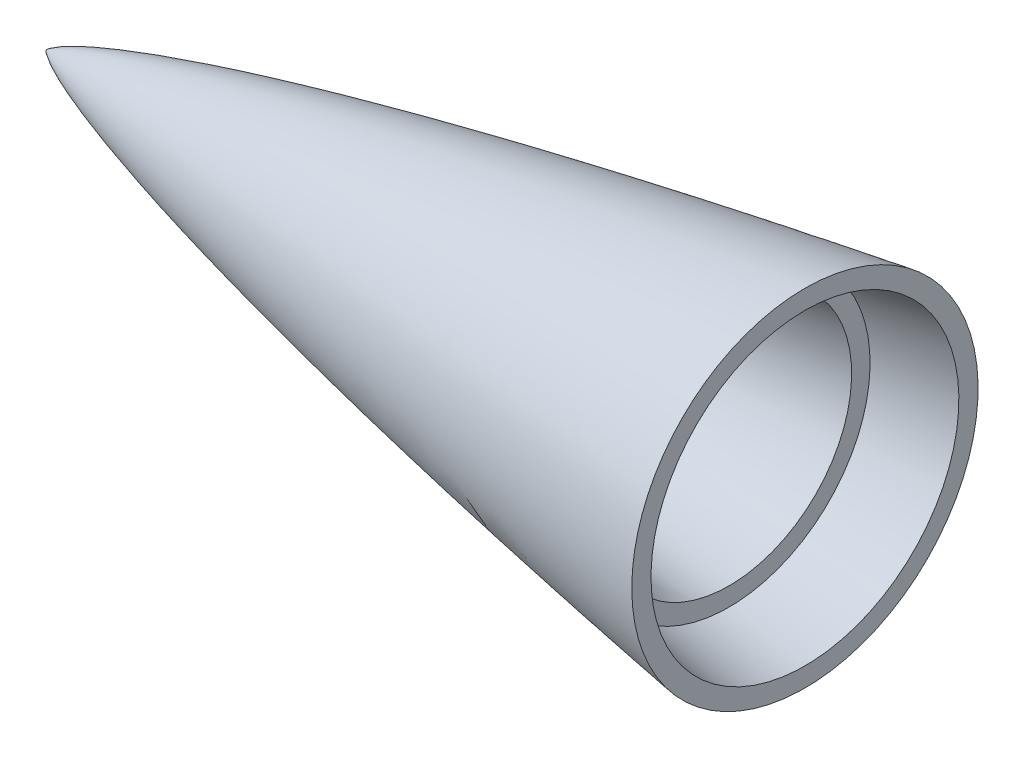
ISO-10303-21;
HEADER;
FILE_DESCRIPTION(('STEP AP214'),'2;1');
FILE_NAME('part.step','',(''),(''),'','','');
FILE_SCHEMA(('AUTOMOTIVE_DESIGN { 1 0 10303 214 1 1 1 1 }'));
ENDSEC;
DATA;
#1=APPLICATION_CONTEXT('core data for automotive mechanical design processes');
#2=APPLICATION_PROTOCOL_DEFINITION('international standard','automotive_design',2000,#1);
#3=PRODUCT_CONTEXT('',#1,'mechanical');
#4=PRODUCT('Part','Part','',(#3));
#5=PRODUCT_RELATED_PRODUCT_CATEGORY('part','',(#4));
#6=PRODUCT_DEFINITION_FORMATION('','',#4);
#7=PRODUCT_DEFINITION_CONTEXT('part definition',#1,'design');
#8=PRODUCT_DEFINITION('design','',#6,#7);
#9=PRODUCT_DEFINITION_SHAPE('','',#8);
#10=(LENGTH_UNIT() NAMED_UNIT(*) SI_UNIT(.MILLI.,.METRE.));
#11=(NAMED_UNIT(*) PLANE_ANGLE_UNIT() SI_UNIT($,.RADIAN.));
#12=(NAMED_UNIT(*) SI_UNIT($,.STERADIAN.) SOLID_ANGLE_UNIT());
#13=UNCERTAINTY_MEASURE_WITH_UNIT(LENGTH_MEASURE(1.E-05),#10,'distance_accuracy_value','');
#14=(GEOMETRIC_REPRESENTATION_CONTEXT(3) GLOBAL_UNCERTAINTY_ASSIGNED_CONTEXT((#13)) GLOBAL_UNIT_ASSIGNED_CONTEXT((#10,
#11,#12)) REPRESENTATION_CONTEXT('',''));
#15=CARTESIAN_POINT('',(0.,0.,0.));
#16=DIRECTION('',(0.,0.,1.));
#17=DIRECTION('',(1.,0.,0.));
#18=AXIS2_PLACEMENT_3D('',#15,#16,#17);
#19=CARTESIAN_POINT('',(26.1856614284903,-8.38738800634786E-12,0.));
#20=CARTESIAN_POINT('',(27.9348791742701,0.535164054084965,0.));
#21=CARTESIAN_POINT('',(31.4347643974329,1.57333071030292,0.));
#22=CARTESIAN_POINT('',(38.5237540836309,3.57268304194308,0.));
#23=CARTESIAN_POINT('',(51.0391320493409,6.88196711734723,0.));
#24=CARTESIAN_POINT('',(69.131470918646,11.2086050069184,0.));
#25=CARTESIAN_POINT('',(91.008065940202,15.9687751668705,0.));
#26=CARTESIAN_POINT('',(112.990556641338,20.398181711693,0.));
#27=CARTESIAN_POINT('',(135.062482466939,24.5623743727088,0.));
#28=CARTESIAN_POINT('',(153.465784260634,27.8375752637029,0.));
#29=CARTESIAN_POINT('',(166.432736317821,30.0533683097572,0.));
#30=CARTESIAN_POINT('',(173.75235637476,31.2808778752435,0.));
#31=CARTESIAN_POINT('',(177.952760003017,31.9754695755409,0.));
#32=CARTESIAN_POINT('',(180.706264379291,32.4277514636555,0.));
#33=CARTESIAN_POINT('',(182.538327405637,32.7278524117791,0.));
#34=CARTESIAN_POINT('',(184.835036967393,33.1021352227538,0.));
#35=CARTESIAN_POINT('',(187.783050397396,33.5784063208399,0.));
#36=CARTESIAN_POINT('',(189.968053571298,33.9304741714369,0.));
#37=CARTESIAN_POINT('',(191.712163039178,34.2101127207354,0.));
#38=CARTESIAN_POINT('',(193.58839605338,34.5095208404204,0.));
#39=CARTESIAN_POINT('',(196.155297324828,34.9167718096902,0.));
#40=CARTESIAN_POINT('',(198.542864688194,35.2937130826708,0.));
#41=CARTESIAN_POINT('',(200.286338815882,35.5678639366724,0.));
#42=CARTESIAN_POINT('',(201.123215352029,35.6990423089567,0.));
#43=CARTESIAN_POINT('',(201.546036418179,35.7652075180218,0.));
#44=(BOUNDED_CURVE() B_SPLINE_CURVE(3,(#19,#20,#21,#22,#23,#24,#25,#26,#27,#28,#29,#30,#31,#32,
#33,#34,#35,#36,#37,#38,#39,#40,#41,#42,#43),.UNSPECIFIED.,.F.,
.F.) B_SPLINE_CURVE_WITH_KNOTS((4,1,1,1,1,1,1,1,1,1,1,1,1,1,1,1,1,1,1,1,1,1,4),
(0.111938462594721,0.136893115946963,0.161847769299205,0.211757076003688,0.311575689412657,
0.411394302821624,0.511212916230592,0.61103152963956,0.710850143048527,0.760759449753011,
0.785714103105253,0.81043327725941,0.816671940597471,0.823146083133616,0.835623409809737,
0.848100736485858,0.860578063161979,0.86681672650004,0.8730553898381,0.885532716514221,
0.898010043190342,0.904248706528402,0.910487369866463),
.UNSPECIFIED.) CURVE() GEOMETRIC_REPRESENTATION_ITEM() RATIONAL_B_SPLINE_CURVE((1.,1.,1.,1.,1.,
1.,1.,1.,1.,1.,1.,1.,1.,1.,1.,1.,1.,1.,1.,1.,1.,1.,1.,1.,1.)) REPRESENTATION_ITEM(''));
#45=CARTESIAN_POINT('',(0.,0.,0.));
#46=DIRECTION('',(-1.,0.,0.));
#47=AXIS1_PLACEMENT('',#45,#46);
#48=SURFACE_OF_REVOLUTION('',#44,#47);
#49=CARTESIAN_POINT('',(26.1856614284903,-8.38738800634786E-12,0.));
#50=VERTEX_POINT('',#49);
#51=VERTEX_LOOP('',#50);
#52=FACE_BOUND('',#51,.T.);
#53=CARTESIAN_POINT('',(180.000002587299,0.,0.));
#54=DIRECTION('',(-1.,0.,0.));
#55=DIRECTION('',(0.,0.,1.));
#56=AXIS2_PLACEMENT_3D('',#53,#54,#55);
#57=CIRCLE('',#56,32.3117175053381);
#58=CARTESIAN_POINT('',(180.000002587299,0.,32.3117175053381));
#59=VERTEX_POINT('',#58);
#60=EDGE_CURVE('E21',#59,#59,#57,.T.);
#61=ORIENTED_EDGE('',*,*,#60,.F.);
#62=EDGE_LOOP('',(#61));
#63=FACE_BOUND('',#62,.T.);
#64=ADVANCED_FACE('F17',(#52,#63),#48,.T.);
#65=CARTESIAN_POINT('',(180.000002587299,0.,0.));
#66=DIRECTION('',(1.,0.,0.));
#67=DIRECTION('',(0.,0.,-1.));
#68=AXIS2_PLACEMENT_3D('',#65,#66,#67);
#69=PLANE('',#68);
#70=CARTESIAN_POINT('',(180.000002586691,0.,0.));
#71=DIRECTION('',(1.,0.,0.));
#72=DIRECTION('',(0.,1.,0.));
#73=AXIS2_PLACEMENT_3D('',#70,#71,#72);
#74=CIRCLE('',#73,37.1729585620193);
#75=CARTESIAN_POINT('',(180.000002586691,37.1729585620193,0.));
#76=VERTEX_POINT('',#75);
#77=EDGE_CURVE('E39',#76,#76,#74,.T.);
#78=ORIENTED_EDGE('',*,*,#77,.T.);
#79=EDGE_LOOP('',(#78));
#80=FACE_BOUND('',#79,.T.);
#81=ORIENTED_EDGE('',*,*,#60,.T.);
#82=EDGE_LOOP('',(#81));
#83=FACE_BOUND('',#82,.T.);
#84=ADVANCED_FACE('F35',(#80,#83),#69,.T.);
#85=CARTESIAN_POINT('',(199.999999999095,0.,0.));
#86=DIRECTION('',(1.,0.,0.));
#87=DIRECTION('',(0.,1.,0.));
#88=AXIS2_PLACEMENT_3D('',#85,#86,#87);
#89=CONICAL_SURFACE('',#88,40.5838805998841,0.1689208935);
#90=CARTESIAN_POINT('',(199.999999999095,0.,0.));
#91=DIRECTION('',(1.,0.,0.));
#92=DIRECTION('',(0.,1.,0.));
#93=AXIS2_PLACEMENT_3D('',#90,#91,#92);
#94=CIRCLE('',#93,40.5838805998841);
#95=CARTESIAN_POINT('',(199.999999999095,40.5838805998841,0.));
#96=VERTEX_POINT('',#95);
#97=EDGE_CURVE('E27',#96,#96,#94,.F.);
#98=ORIENTED_EDGE('',*,*,#97,.F.);
#99=EDGE_LOOP('',(#98));
#100=FACE_BOUND('',#99,.T.);
#101=ORIENTED_EDGE('',*,*,#77,.F.);
#102=EDGE_LOOP('',(#101));
#103=FACE_BOUND('',#102,.T.);
#104=ADVANCED_FACE('F65',(#100,#103),#89,.F.);
#105=CARTESIAN_POINT('',(199.999999999773,5.04537877301521E-11,0.));
#106=DIRECTION('',(1.,0.,0.));
#107=DIRECTION('',(0.,0.,-1.));
#108=AXIS2_PLACEMENT_3D('',#105,#106,#107);
#109=PLANE('',#108);
#110=CARTESIAN_POINT('',(199.999999999773,0.,0.));
#111=DIRECTION('',(-1.,0.,0.));
#112=DIRECTION('',(0.,0.,1.));
#113=AXIS2_PLACEMENT_3D('',#110,#111,#112);
#114=CIRCLE('',#113,45.6449732741235);
#115=CARTESIAN_POINT('',(199.999999999773,0.,45.6449732741235));
#116=VERTEX_POINT('',#115);
#117=EDGE_CURVE('E11',#116,#116,#114,.T.);
#118=ORIENTED_EDGE('',*,*,#117,.F.);
#119=EDGE_LOOP('',(#118));
#120=FACE_BOUND('',#119,.T.);
#121=ORIENTED_EDGE('',*,*,#97,.T.);
#122=EDGE_LOOP('',(#121));
#123=FACE_BOUND('',#122,.T.);
#124=ADVANCED_FACE('F62',(#120,#123),#109,.T.);
#125=CARTESIAN_POINT('',(0.,0.,0.));
#126=CARTESIAN_POINT('',(0.00269299265690137,0.0105570255602973,0.));
#127=CARTESIAN_POINT('',(0.00981766532215249,0.0310027808727483,0.));
#128=CARTESIAN_POINT('',(0.0308862281076318,0.0692061143923841,0.));
#129=CARTESIAN_POINT('',(0.0757583192031203,0.134167778258145,0.));
#130=CARTESIAN_POINT('',(0.142201594462609,0.213041549142351,0.));
#131=CARTESIAN_POINT('',(0.241920025069456,0.316054381983302,0.));
#132=CARTESIAN_POINT('',(0.388071897428893,0.449727255822496,0.));
#133=CARTESIAN_POINT('',(0.606162752919155,0.62857322269196,0.));
#134=CARTESIAN_POINT('',(0.959892334821041,0.887672015135921,0.));
#135=CARTESIAN_POINT('',(1.54785745265765,1.27102124846149,0.));
#136=CARTESIAN_POINT('',(2.54518155467274,1.8463175932226,0.));
#137=CARTESIAN_POINT('',(4.26573740859224,2.72067885976824,0.));
#138=CARTESIAN_POINT('',(7.25817903123531,4.05204954360162,0.));
#139=CARTESIAN_POINT('',(12.0982212913503,5.93178108719724,0.));
#140=CARTESIAN_POINT('',(20.0953368583718,8.66017507869464,0.));
#141=CARTESIAN_POINT('',(30.955304897707,11.9079561356724,0.));
#142=CARTESIAN_POINT('',(44.0712901168884,15.4305928267583,0.));
#143=CARTESIAN_POINT('',(58.7675954079856,19.0372033194619,0.));
#144=CARTESIAN_POINT('',(73.5186279398738,22.4096864917461,0.));
#145=CARTESIAN_POINT('',(86.4623910744783,25.1972446397707,0.));
#146=CARTESIAN_POINT('',(97.5765435143634,27.4901914693279,0.));
#147=CARTESIAN_POINT('',(106.850962723898,29.3434587920646,0.));
#148=CARTESIAN_POINT('',(114.275148833096,30.7937975432968,0.));
#149=CARTESIAN_POINT('',(121.708506513057,32.2144883520177,0.));
#150=CARTESIAN_POINT('',(129.141304101281,33.6059646814926,0.));
#151=CARTESIAN_POINT('',(136.58905613808,34.972164123208,0.));
#152=CARTESIAN_POINT('',(144.024827503021,36.3103195098583,0.));
#153=CARTESIAN_POINT('',(151.49245709271,37.6284934415172,0.));
#154=CARTESIAN_POINT('',(158.918183648489,38.9162572054691,0.));
#155=CARTESIAN_POINT('',(166.426487092142,40.1940538482682,0.));
#156=CARTESIAN_POINT('',(172.872301541373,41.2734726203389,0.));
#157=CARTESIAN_POINT('',(178.601931605518,42.2174441849816,0.));
#158=CARTESIAN_POINT('',(183.060356362613,42.945973323711,0.));
#159=CARTESIAN_POINT('',(187.167993674858,43.6083482060408,0.));
#160=CARTESIAN_POINT('',(191.11763203426,44.2446334220058,0.));
#161=CARTESIAN_POINT('',(195.790632950993,44.9838892993748,0.));
#162=CARTESIAN_POINT('',(198.298590468492,45.3787279841996,0.));
#163=CARTESIAN_POINT('',(199.999999999703,45.6449732741125,0.));
#164=(BOUNDED_CURVE() B_SPLINE_CURVE(4,(#125,#126,#127,#128,#129,#130,#131,#132,#133,#134,#135,
#136,#137,#138,#139,#140,#141,#142,#143,#144,#145,#146,#147,#148,#149,#150,#151,#152,#153,#154,
#155,#156,#157,#158,#159,#160,#161,#162,#163),.UNSPECIFIED.,.F.,
.F.) B_SPLINE_CURVE_WITH_KNOTS((5,1,1,1,1,1,1,1,1,1,1,1,1,1,1,1,1,1,1,1,1,1,1,1,1,1,1,1,1,1,1,1,
1,1,1,5),(0.,0.000192027866153324,0.000384055732306648,0.000768111464613296,0.00139619963434724,
0.00201405853645483,0.00291996148677542,0.00427117123217271,0.00638502387834455,
0.00976964963338275,0.0153348203450705,0.0246364879907877,0.0405232239883734,0.067705990914472,
0.10718653095423,0.17412826876597,0.241070004308363,0.308011738418261,0.374953475617041,
0.441895211204221,0.475366080453439,0.508836949702656,0.542307818164415,0.575778686626174,
0.609249554722491,0.642720422818808,0.676191291368515,0.709662159918222,0.743133028567495,
0.776603897216769,0.810074765423011,0.826810199526131,0.843545633629252,0.860281067688555,
0.877016501747858,0.910487369866463),
.UNSPECIFIED.) CURVE() GEOMETRIC_REPRESENTATION_ITEM() RATIONAL_B_SPLINE_CURVE((1.,1.,1.,1.,1.,
1.,1.,1.,1.,1.,1.,1.,1.,1.,1.,1.,1.,1.,1.,1.,1.,1.,1.,1.,1.,1.,1.,1.,1.,1.,1.,1.,1.,1.,1.,1.,1.,
1.,1.)) REPRESENTATION_ITEM(''));
#165=CARTESIAN_POINT('',(0.,0.,0.));
#166=DIRECTION('',(-1.,0.,0.));
#167=AXIS1_PLACEMENT('',#165,#166);
#168=SURFACE_OF_REVOLUTION('',#164,#167);
#169=CARTESIAN_POINT('',(0.,0.,0.));
#170=VERTEX_POINT('',#169);
#171=VERTEX_LOOP('',#170);
#172=FACE_BOUND('',#171,.T.);
#173=ORIENTED_EDGE('',*,*,#117,.T.);
#174=EDGE_LOOP('',(#173));
#175=FACE_BOUND('',#174,.T.);
#176=ADVANCED_FACE('F59',(#172,#175),#168,.F.);
#177=CLOSED_SHELL('',(#64,#84,#104,#124,#176));
#178=MANIFOLD_SOLID_BREP('B1',#177);
#179=ADVANCED_BREP_SHAPE_REPRESENTATION('',(#18,#178),#14);
#180=SHAPE_DEFINITION_REPRESENTATION(#9,#179);
ENDSEC;
END-ISO-10303-21;
